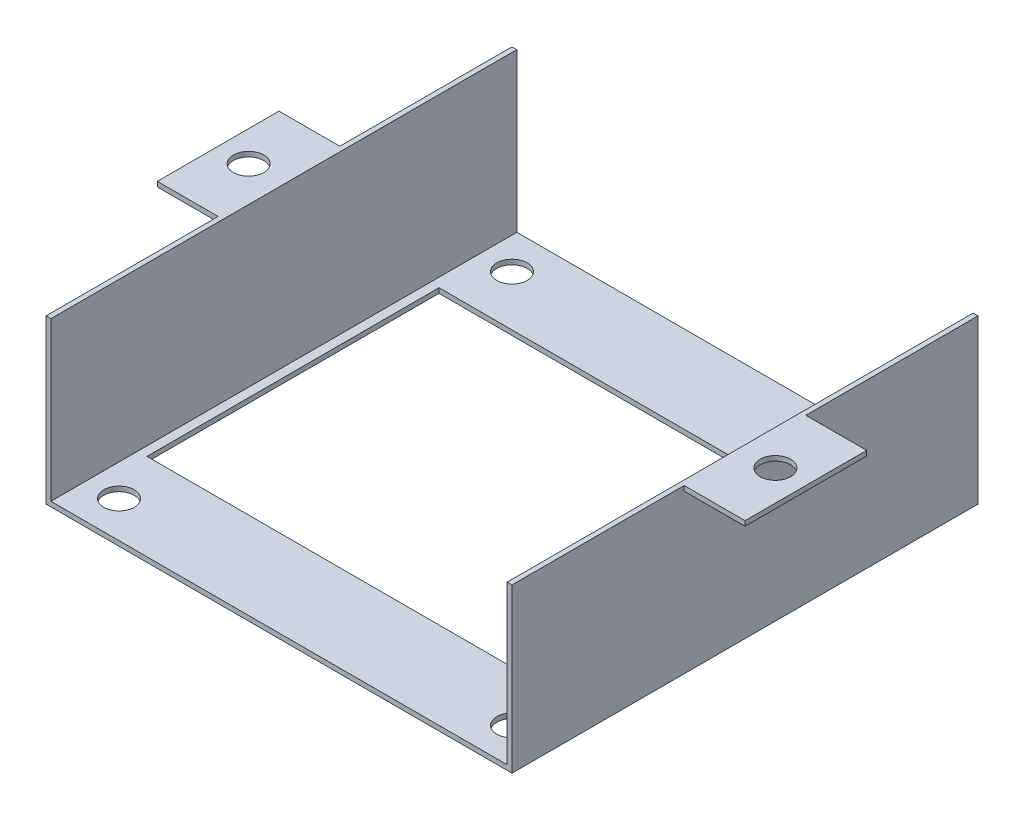
ISO-10303-21;
HEADER;
FILE_DESCRIPTION(('STEP AP214'),'2;1');
FILE_NAME('part.step','',(''),(''),'','','');
FILE_SCHEMA(('AUTOMOTIVE_DESIGN { 1 0 10303 214 1 1 1 1 }'));
ENDSEC;
DATA;
#1=APPLICATION_CONTEXT('core data for automotive mechanical design processes');
#2=APPLICATION_PROTOCOL_DEFINITION('international standard','automotive_design',2000,#1);
#3=PRODUCT_CONTEXT('',#1,'mechanical');
#4=PRODUCT('Part','Part','',(#3));
#5=PRODUCT_RELATED_PRODUCT_CATEGORY('part','',(#4));
#6=PRODUCT_DEFINITION_FORMATION('','',#4);
#7=PRODUCT_DEFINITION_CONTEXT('part definition',#1,'design');
#8=PRODUCT_DEFINITION('design','',#6,#7);
#9=PRODUCT_DEFINITION_SHAPE('','',#8);
#10=(LENGTH_UNIT() NAMED_UNIT(*) SI_UNIT(.MILLI.,.METRE.));
#11=(NAMED_UNIT(*) PLANE_ANGLE_UNIT() SI_UNIT($,.RADIAN.));
#12=(NAMED_UNIT(*) SI_UNIT($,.STERADIAN.) SOLID_ANGLE_UNIT());
#13=UNCERTAINTY_MEASURE_WITH_UNIT(LENGTH_MEASURE(1.E-05),#10,'distance_accuracy_value','');
#14=(GEOMETRIC_REPRESENTATION_CONTEXT(3) GLOBAL_UNCERTAINTY_ASSIGNED_CONTEXT((#13)) GLOBAL_UNIT_ASSIGNED_CONTEXT((#10,
#11,#12)) REPRESENTATION_CONTEXT('',''));
#15=CARTESIAN_POINT('',(0.,0.,0.));
#16=DIRECTION('',(0.,0.,1.));
#17=DIRECTION('',(1.,0.,0.));
#18=AXIS2_PLACEMENT_3D('',#15,#16,#17);
#19=CARTESIAN_POINT('',(0.,26.8,0.));
#20=DIRECTION('',(0.,-1.,0.));
#21=DIRECTION('',(0.,0.,-1.));
#22=AXIS2_PLACEMENT_3D('',#19,#20,#21);
#23=PLANE('',#22);
#24=CARTESIAN_POINT('',(80.8,26.8,37.5));
#25=DIRECTION('',(0.,1.,0.));
#26=DIRECTION('',(0.,0.,1.));
#27=AXIS2_PLACEMENT_3D('',#24,#25,#26);
#28=CIRCLE('',#27,2.49999999999999);
#29=CARTESIAN_POINT('',(80.8,26.8,40.));
#30=VERTEX_POINT('',#29);
#31=EDGE_CURVE('E278',#30,#30,#28,.T.);
#32=ORIENTED_EDGE('',*,*,#31,.F.);
#33=EDGE_LOOP('',(#32));
#34=FACE_BOUND('',#33,.T.);
#35=DIRECTION('',(1.,0.,0.));
#36=VECTOR('',#35,1.);
#37=CARTESIAN_POINT('',(-0.799999999999991,26.8,-0.8));
#38=LINE('',#37,#36);
#39=CARTESIAN_POINT('',(75.,26.8,-0.799999999999995));
#40=VERTEX_POINT('',#39);
#41=CARTESIAN_POINT('',(75.8,26.8,-0.8));
#42=VERTEX_POINT('',#41);
#43=EDGE_CURVE('E197',#40,#42,#38,.T.);
#44=ORIENTED_EDGE('',*,*,#43,.F.);
#45=DIRECTION('',(0.,0.,1.));
#46=VECTOR('',#45,1.);
#47=CARTESIAN_POINT('',(75.,26.8,75.));
#48=LINE('',#47,#46);
#49=CARTESIAN_POINT('',(75.,26.8,75.8));
#50=VERTEX_POINT('',#49);
#51=EDGE_CURVE('E179',#40,#50,#48,.T.);
#52=ORIENTED_EDGE('',*,*,#51,.T.);
#53=DIRECTION('',(-1.,0.,0.));
#54=VECTOR('',#53,1.);
#55=CARTESIAN_POINT('',(-0.800000000000001,26.8,75.8));
#56=LINE('',#55,#54);
#57=CARTESIAN_POINT('',(75.8,26.8,75.8));
#58=VERTEX_POINT('',#57);
#59=EDGE_CURVE('E205',#58,#50,#56,.T.);
#60=ORIENTED_EDGE('',*,*,#59,.F.);
#61=DIRECTION('',(0.,0.,1.));
#62=VECTOR('',#61,1.);
#63=CARTESIAN_POINT('',(75.8,26.8,75.8));
#64=LINE('',#63,#62);
#65=CARTESIAN_POINT('',(75.8,26.8,47.5));
#66=VERTEX_POINT('',#65);
#67=EDGE_CURVE('E196',#66,#58,#64,.T.);
#68=ORIENTED_EDGE('',*,*,#67,.F.);
#69=DIRECTION('',(1.,0.,0.));
#70=VECTOR('',#69,1.);
#71=CARTESIAN_POINT('',(75.,26.8,47.5));
#72=LINE('',#71,#70);
#73=CARTESIAN_POINT('',(85.8,26.8,47.5));
#74=VERTEX_POINT('',#73);
#75=EDGE_CURVE('E309',#66,#74,#72,.T.);
#76=ORIENTED_EDGE('',*,*,#75,.T.);
#77=DIRECTION('',(0.,0.,-1.));
#78=VECTOR('',#77,1.);
#79=CARTESIAN_POINT('',(85.8,26.8,27.5));
#80=LINE('',#79,#78);
#81=CARTESIAN_POINT('',(85.8,26.8,27.5));
#82=VERTEX_POINT('',#81);
#83=EDGE_CURVE('E321',#74,#82,#80,.T.);
#84=ORIENTED_EDGE('',*,*,#83,.T.);
#85=DIRECTION('',(-1.,0.,0.));
#86=VECTOR('',#85,1.);
#87=CARTESIAN_POINT('',(75.,26.8,27.5));
#88=LINE('',#87,#86);
#89=CARTESIAN_POINT('',(75.8,26.8,27.5));
#90=VERTEX_POINT('',#89);
#91=EDGE_CURVE('E313',#82,#90,#88,.T.);
#92=ORIENTED_EDGE('',*,*,#91,.T.);
#93=EDGE_CURVE('E199',#42,#90,#64,.T.);
#94=ORIENTED_EDGE('',*,*,#93,.F.);
#95=EDGE_LOOP('',(#44,#52,#60,#68,#76,#84,#92,#94));
#96=FACE_BOUND('',#95,.T.);
#97=ADVANCED_FACE('F33',(#34,#96),#23,.F.);
#98=CARTESIAN_POINT('',(0.,0.8,0.));
#99=DIRECTION('',(0.,1.,0.));
#100=DIRECTION('',(0.,0.,1.));
#101=AXIS2_PLACEMENT_3D('',#98,#99,#100);
#102=PLANE('',#101);
#103=CARTESIAN_POINT('',(69.8,0.8,5.2));
#104=DIRECTION('',(0.,1.,0.));
#105=DIRECTION('',(0.,0.,1.));
#106=AXIS2_PLACEMENT_3D('',#103,#104,#105);
#107=CIRCLE('',#106,2.5);
#108=CARTESIAN_POINT('',(69.8,0.8,7.69999999999999));
#109=VERTEX_POINT('',#108);
#110=EDGE_CURVE('E492',#109,#109,#107,.T.);
#111=ORIENTED_EDGE('',*,*,#110,.F.);
#112=EDGE_LOOP('',(#111));
#113=FACE_BOUND('',#112,.T.);
#114=CARTESIAN_POINT('',(5.20000000000002,0.8,5.19999999999999));
#115=DIRECTION('',(0.,1.,0.));
#116=DIRECTION('',(0.,0.,1.));
#117=AXIS2_PLACEMENT_3D('',#114,#115,#116);
#118=CIRCLE('',#117,2.49999999999999);
#119=CARTESIAN_POINT('',(5.20000000000002,0.8,7.69999999999998));
#120=VERTEX_POINT('',#119);
#121=EDGE_CURVE('E488',#120,#120,#118,.T.);
#122=ORIENTED_EDGE('',*,*,#121,.F.);
#123=EDGE_LOOP('',(#122));
#124=FACE_BOUND('',#123,.T.);
#125=CARTESIAN_POINT('',(5.20000000000002,0.8,69.8));
#126=DIRECTION('',(0.,1.,0.));
#127=DIRECTION('',(0.,0.,1.));
#128=AXIS2_PLACEMENT_3D('',#125,#126,#127);
#129=CIRCLE('',#128,2.49999999999999);
#130=CARTESIAN_POINT('',(5.20000000000002,0.8,72.3));
#131=VERTEX_POINT('',#130);
#132=EDGE_CURVE('E479',#131,#131,#129,.T.);
#133=ORIENTED_EDGE('',*,*,#132,.F.);
#134=EDGE_LOOP('',(#133));
#135=FACE_BOUND('',#134,.T.);
#136=CARTESIAN_POINT('',(69.8,0.8,69.8));
#137=DIRECTION('',(0.,1.,0.));
#138=DIRECTION('',(0.,0.,1.));
#139=AXIS2_PLACEMENT_3D('',#136,#137,#138);
#140=CIRCLE('',#139,2.5);
#141=CARTESIAN_POINT('',(69.8,0.8,72.3));
#142=VERTEX_POINT('',#141);
#143=EDGE_CURVE('E266',#142,#142,#140,.T.);
#144=ORIENTED_EDGE('',*,*,#143,.F.);
#145=EDGE_LOOP('',(#144));
#146=FACE_BOUND('',#145,.T.);
#147=DIRECTION('',(0.,0.,1.));
#148=VECTOR('',#147,1.);
#149=CARTESIAN_POINT('',(0.,0.8,0.));
#150=LINE('',#149,#148);
#151=CARTESIAN_POINT('',(0.,0.8,-0.799999999999995));
#152=VERTEX_POINT('',#151);
#153=CARTESIAN_POINT('',(0.,0.8,75.8));
#154=VERTEX_POINT('',#153);
#155=EDGE_CURVE('E42',#152,#154,#150,.T.);
#156=ORIENTED_EDGE('',*,*,#155,.T.);
#157=DIRECTION('',(1.,0.,0.));
#158=VECTOR('',#157,1.);
#159=CARTESIAN_POINT('',(0.,0.8,75.8));
#160=LINE('',#159,#158);
#161=CARTESIAN_POINT('',(75.,0.8,75.8));
#162=VERTEX_POINT('',#161);
#163=EDGE_CURVE('E262',#154,#162,#160,.T.);
#164=ORIENTED_EDGE('',*,*,#163,.T.);
#165=DIRECTION('',(0.,0.,-1.));
#166=VECTOR('',#165,1.);
#167=CARTESIAN_POINT('',(75.,0.8,0.));
#168=LINE('',#167,#166);
#169=CARTESIAN_POINT('',(75.,0.8,-0.799999999999995));
#170=VERTEX_POINT('',#169);
#171=EDGE_CURVE('E11',#162,#170,#168,.T.);
#172=ORIENTED_EDGE('',*,*,#171,.T.);
#173=DIRECTION('',(1.,0.,0.));
#174=VECTOR('',#173,1.);
#175=CARTESIAN_POINT('',(0.,0.8,-0.799999999999995));
#176=LINE('',#175,#174);
#177=EDGE_CURVE('E188',#152,#170,#176,.T.);
#178=ORIENTED_EDGE('',*,*,#177,.F.);
#179=EDGE_LOOP('',(#156,#164,#172,#178));
#180=FACE_BOUND('',#179,.T.);
#181=DIRECTION('',(-1.,0.,0.));
#182=VECTOR('',#181,1.);
#183=CARTESIAN_POINT('',(73.5,0.8,13.5));
#184=LINE('',#183,#182);
#185=CARTESIAN_POINT('',(73.5,0.8,13.5));
#186=VERTEX_POINT('',#185);
#187=CARTESIAN_POINT('',(1.50000000000002,0.8,13.5));
#188=VERTEX_POINT('',#187);
#189=EDGE_CURVE('E231',#186,#188,#184,.T.);
#190=ORIENTED_EDGE('',*,*,#189,.F.);
#191=DIRECTION('',(0.,0.,-1.));
#192=VECTOR('',#191,1.);
#193=CARTESIAN_POINT('',(73.5,0.8,61.5));
#194=LINE('',#193,#192);
#195=CARTESIAN_POINT('',(73.5,0.8,61.5));
#196=VERTEX_POINT('',#195);
#197=EDGE_CURVE('E229',#196,#186,#194,.T.);
#198=ORIENTED_EDGE('',*,*,#197,.F.);
#199=DIRECTION('',(1.,0.,0.));
#200=VECTOR('',#199,1.);
#201=CARTESIAN_POINT('',(1.50000000000001,0.8,61.5));
#202=LINE('',#201,#200);
#203=CARTESIAN_POINT('',(1.50000000000001,0.8,61.5));
#204=VERTEX_POINT('',#203);
#205=EDGE_CURVE('E237',#204,#196,#202,.T.);
#206=ORIENTED_EDGE('',*,*,#205,.F.);
#207=DIRECTION('',(0.,0.,1.));
#208=VECTOR('',#207,1.);
#209=CARTESIAN_POINT('',(1.50000000000002,0.8,13.5));
#210=LINE('',#209,#208);
#211=EDGE_CURVE('E234',#188,#204,#210,.T.);
#212=ORIENTED_EDGE('',*,*,#211,.F.);
#213=EDGE_LOOP('',(#190,#198,#206,#212));
#214=FACE_BOUND('',#213,.T.);
#215=ADVANCED_FACE('F259',(#113,#124,#135,#146,#180,#214),#102,.T.);
#216=CARTESIAN_POINT('',(0.,0.,0.));
#217=DIRECTION('',(0.,1.,0.));
#218=DIRECTION('',(0.,0.,1.));
#219=AXIS2_PLACEMENT_3D('',#216,#217,#218);
#220=PLANE('',#219);
#221=CARTESIAN_POINT('',(69.8,0.,5.2));
#222=DIRECTION('',(0.,-1.,0.));
#223=DIRECTION('',(0.,0.,-1.));
#224=AXIS2_PLACEMENT_3D('',#221,#222,#223);
#225=CIRCLE('',#224,2.49999999999999);
#226=CARTESIAN_POINT('',(69.8,0.,2.70000000000001));
#227=VERTEX_POINT('',#226);
#228=EDGE_CURVE('E466',#227,#227,#225,.T.);
#229=ORIENTED_EDGE('',*,*,#228,.F.);
#230=EDGE_LOOP('',(#229));
#231=FACE_BOUND('',#230,.T.);
#232=CARTESIAN_POINT('',(5.20000000000002,0.,5.19999999999999));
#233=DIRECTION('',(0.,-1.,0.));
#234=DIRECTION('',(0.,0.,-1.));
#235=AXIS2_PLACEMENT_3D('',#232,#233,#234);
#236=CIRCLE('',#235,2.49999999999999);
#237=CARTESIAN_POINT('',(5.20000000000002,0.,2.7));
#238=VERTEX_POINT('',#237);
#239=EDGE_CURVE('E470',#238,#238,#236,.T.);
#240=ORIENTED_EDGE('',*,*,#239,.F.);
#241=EDGE_LOOP('',(#240));
#242=FACE_BOUND('',#241,.T.);
#243=CARTESIAN_POINT('',(5.20000000000002,0.,69.8));
#244=DIRECTION('',(0.,-1.,0.));
#245=DIRECTION('',(0.,0.,-1.));
#246=AXIS2_PLACEMENT_3D('',#243,#244,#245);
#247=CIRCLE('',#246,2.49999999999999);
#248=CARTESIAN_POINT('',(5.20000000000002,0.,67.3));
#249=VERTEX_POINT('',#248);
#250=EDGE_CURVE('E474',#249,#249,#247,.T.);
#251=ORIENTED_EDGE('',*,*,#250,.F.);
#252=EDGE_LOOP('',(#251));
#253=FACE_BOUND('',#252,.T.);
#254=CARTESIAN_POINT('',(69.8,0.,69.8));
#255=DIRECTION('',(0.,-1.,0.));
#256=DIRECTION('',(0.,0.,-1.));
#257=AXIS2_PLACEMENT_3D('',#254,#255,#256);
#258=CIRCLE('',#257,2.49999999999999);
#259=CARTESIAN_POINT('',(69.8,0.,67.3));
#260=VERTEX_POINT('',#259);
#261=EDGE_CURVE('E477',#260,#260,#258,.T.);
#262=ORIENTED_EDGE('',*,*,#261,.F.);
#263=EDGE_LOOP('',(#262));
#264=FACE_BOUND('',#263,.T.);
#265=DIRECTION('',(0.,0.,-1.));
#266=VECTOR('',#265,1.);
#267=CARTESIAN_POINT('',(73.5,0.,37.5));
#268=LINE('',#267,#266);
#269=CARTESIAN_POINT('',(73.5,0.,61.5));
#270=VERTEX_POINT('',#269);
#271=CARTESIAN_POINT('',(73.5,0.,13.5));
#272=VERTEX_POINT('',#271);
#273=EDGE_CURVE('E223',#270,#272,#268,.T.);
#274=ORIENTED_EDGE('',*,*,#273,.T.);
#275=DIRECTION('',(-1.,0.,0.));
#276=VECTOR('',#275,1.);
#277=CARTESIAN_POINT('',(73.5,0.,13.5));
#278=LINE('',#277,#276);
#279=CARTESIAN_POINT('',(1.50000000000002,0.,13.5));
#280=VERTEX_POINT('',#279);
#281=EDGE_CURVE('E242',#272,#280,#278,.T.);
#282=ORIENTED_EDGE('',*,*,#281,.T.);
#283=DIRECTION('',(0.,0.,1.));
#284=VECTOR('',#283,1.);
#285=CARTESIAN_POINT('',(1.50000000000002,0.,13.5));
#286=LINE('',#285,#284);
#287=CARTESIAN_POINT('',(1.50000000000001,0.,61.5));
#288=VERTEX_POINT('',#287);
#289=EDGE_CURVE('E245',#280,#288,#286,.T.);
#290=ORIENTED_EDGE('',*,*,#289,.T.);
#291=DIRECTION('',(1.,0.,0.));
#292=VECTOR('',#291,1.);
#293=CARTESIAN_POINT('',(1.50000000000001,0.,61.5));
#294=LINE('',#293,#292);
#295=EDGE_CURVE('E232',#288,#270,#294,.T.);
#296=ORIENTED_EDGE('',*,*,#295,.T.);
#297=EDGE_LOOP('',(#274,#282,#290,#296));
#298=FACE_BOUND('',#297,.T.);
#299=DIRECTION('',(0.,0.,-1.));
#300=VECTOR('',#299,1.);
#301=CARTESIAN_POINT('',(-0.800000000000001,0.,75.8));
#302=LINE('',#301,#300);
#303=CARTESIAN_POINT('',(-0.800000000000001,0.,75.8));
#304=VERTEX_POINT('',#303);
#305=CARTESIAN_POINT('',(-0.799999999999991,0.,-0.8));
#306=VERTEX_POINT('',#305);
#307=EDGE_CURVE('E208',#304,#306,#302,.T.);
#308=ORIENTED_EDGE('',*,*,#307,.T.);
#309=DIRECTION('',(1.,0.,0.));
#310=VECTOR('',#309,1.);
#311=CARTESIAN_POINT('',(-0.799999999999991,0.,-0.8));
#312=LINE('',#311,#310);
#313=CARTESIAN_POINT('',(75.8,0.,-0.8));
#314=VERTEX_POINT('',#313);
#315=EDGE_CURVE('E211',#306,#314,#312,.T.);
#316=ORIENTED_EDGE('',*,*,#315,.T.);
#317=DIRECTION('',(0.,0.,1.));
#318=VECTOR('',#317,1.);
#319=CARTESIAN_POINT('',(75.8,0.,75.8));
#320=LINE('',#319,#318);
#321=CARTESIAN_POINT('',(75.8,0.,75.8));
#322=VERTEX_POINT('',#321);
#323=EDGE_CURVE('E214',#314,#322,#320,.T.);
#324=ORIENTED_EDGE('',*,*,#323,.T.);
#325=DIRECTION('',(-1.,0.,0.));
#326=VECTOR('',#325,1.);
#327=CARTESIAN_POINT('',(-0.800000000000001,0.,75.8));
#328=LINE('',#327,#326);
#329=EDGE_CURVE('E217',#322,#304,#328,.T.);
#330=ORIENTED_EDGE('',*,*,#329,.T.);
#331=EDGE_LOOP('',(#308,#316,#324,#330));
#332=FACE_BOUND('',#331,.T.);
#333=ADVANCED_FACE('F35',(#231,#242,#253,#264,#298,#332),#220,.F.);
#334=CARTESIAN_POINT('',(73.5,0.8,37.5));
#335=DIRECTION('',(-1.,0.,0.));
#336=DIRECTION('',(0.,0.,1.));
#337=AXIS2_PLACEMENT_3D('',#334,#335,#336);
#338=PLANE('',#337);
#339=ORIENTED_EDGE('',*,*,#273,.F.);
#340=DIRECTION('',(0.,-1.,0.));
#341=VECTOR('',#340,1.);
#342=CARTESIAN_POINT('',(73.5,0.8,61.5));
#343=LINE('',#342,#341);
#344=EDGE_CURVE('E239',#196,#270,#343,.T.);
#345=ORIENTED_EDGE('',*,*,#344,.F.);
#346=ORIENTED_EDGE('',*,*,#197,.T.);
#347=DIRECTION('',(0.,-1.,0.));
#348=VECTOR('',#347,1.);
#349=CARTESIAN_POINT('',(73.5,0.8,13.5));
#350=LINE('',#349,#348);
#351=EDGE_CURVE('E255',#186,#272,#350,.T.);
#352=ORIENTED_EDGE('',*,*,#351,.T.);
#353=EDGE_LOOP('',(#339,#345,#346,#352));
#354=FACE_BOUND('',#353,.T.);
#355=ADVANCED_FACE('F441',(#354),#338,.T.);
#356=CARTESIAN_POINT('',(73.5,0.8,13.5));
#357=DIRECTION('',(0.,0.,1.));
#358=DIRECTION('',(1.,0.,0.));
#359=AXIS2_PLACEMENT_3D('',#356,#357,#358);
#360=PLANE('',#359);
#361=ORIENTED_EDGE('',*,*,#281,.F.);
#362=ORIENTED_EDGE('',*,*,#351,.F.);
#363=ORIENTED_EDGE('',*,*,#189,.T.);
#364=DIRECTION('',(0.,-1.,0.));
#365=VECTOR('',#364,1.);
#366=CARTESIAN_POINT('',(1.50000000000002,0.8,13.5));
#367=LINE('',#366,#365);
#368=EDGE_CURVE('E253',#188,#280,#367,.T.);
#369=ORIENTED_EDGE('',*,*,#368,.T.);
#370=EDGE_LOOP('',(#361,#362,#363,#369));
#371=FACE_BOUND('',#370,.T.);
#372=ADVANCED_FACE('F437',(#371),#360,.T.);
#373=CARTESIAN_POINT('',(1.50000000000002,0.8,13.5));
#374=DIRECTION('',(1.,0.,0.));
#375=DIRECTION('',(0.,0.,-1.));
#376=AXIS2_PLACEMENT_3D('',#373,#374,#375);
#377=PLANE('',#376);
#378=ORIENTED_EDGE('',*,*,#289,.F.);
#379=ORIENTED_EDGE('',*,*,#368,.F.);
#380=ORIENTED_EDGE('',*,*,#211,.T.);
#381=DIRECTION('',(0.,-1.,0.));
#382=VECTOR('',#381,1.);
#383=CARTESIAN_POINT('',(1.50000000000001,0.8,61.5));
#384=LINE('',#383,#382);
#385=EDGE_CURVE('E251',#204,#288,#384,.T.);
#386=ORIENTED_EDGE('',*,*,#385,.T.);
#387=EDGE_LOOP('',(#378,#379,#380,#386));
#388=FACE_BOUND('',#387,.T.);
#389=ADVANCED_FACE('F430',(#388),#377,.T.);
#390=CARTESIAN_POINT('',(1.50000000000001,0.8,61.5));
#391=DIRECTION('',(0.,0.,-1.));
#392=DIRECTION('',(-1.,0.,0.));
#393=AXIS2_PLACEMENT_3D('',#390,#391,#392);
#394=PLANE('',#393);
#395=ORIENTED_EDGE('',*,*,#295,.F.);
#396=ORIENTED_EDGE('',*,*,#385,.F.);
#397=ORIENTED_EDGE('',*,*,#205,.T.);
#398=ORIENTED_EDGE('',*,*,#344,.T.);
#399=EDGE_LOOP('',(#395,#396,#397,#398));
#400=FACE_BOUND('',#399,.T.);
#401=ADVANCED_FACE('F424',(#400),#394,.T.);
#402=CARTESIAN_POINT('',(-0.800000000000001,26.8,75.8));
#403=DIRECTION('',(-1.,0.,0.));
#404=DIRECTION('',(0.,0.,1.));
#405=AXIS2_PLACEMENT_3D('',#402,#403,#404);
#406=PLANE('',#405);
#407=DIRECTION('',(0.,-1.,0.));
#408=VECTOR('',#407,1.);
#409=CARTESIAN_POINT('',(-0.799999999999995,26.8,27.5));
#410=LINE('',#409,#408);
#411=CARTESIAN_POINT('',(-0.800000000000001,26.8,27.5));
#412=VERTEX_POINT('',#411);
#413=CARTESIAN_POINT('',(-0.799999999999995,26.,27.5));
#414=VERTEX_POINT('',#413);
#415=EDGE_CURVE('E307',#412,#414,#410,.T.);
#416=ORIENTED_EDGE('',*,*,#415,.F.);
#417=DIRECTION('',(0.,0.,-1.));
#418=VECTOR('',#417,1.);
#419=CARTESIAN_POINT('',(-0.800000000000001,26.8,75.8));
#420=LINE('',#419,#418);
#421=CARTESIAN_POINT('',(-0.799999999999991,26.8,-0.8));
#422=VERTEX_POINT('',#421);
#423=EDGE_CURVE('E220',#412,#422,#420,.T.);
#424=ORIENTED_EDGE('',*,*,#423,.T.);
#425=DIRECTION('',(0.,-1.,0.));
#426=VECTOR('',#425,1.);
#427=CARTESIAN_POINT('',(-0.799999999999991,26.8,-0.8));
#428=LINE('',#427,#426);
#429=EDGE_CURVE('E195',#422,#306,#428,.T.);
#430=ORIENTED_EDGE('',*,*,#429,.T.);
#431=ORIENTED_EDGE('',*,*,#307,.F.);
#432=DIRECTION('',(0.,-1.,0.));
#433=VECTOR('',#432,1.);
#434=CARTESIAN_POINT('',(-0.800000000000001,26.8,75.8));
#435=LINE('',#434,#433);
#436=CARTESIAN_POINT('',(-0.800000000000001,26.8,75.8));
#437=VERTEX_POINT('',#436);
#438=EDGE_CURVE('E221',#437,#304,#435,.T.);
#439=ORIENTED_EDGE('',*,*,#438,.F.);
#440=CARTESIAN_POINT('',(-0.799999999999997,26.8,47.5));
#441=VERTEX_POINT('',#440);
#442=EDGE_CURVE('E201',#437,#441,#420,.T.);
#443=ORIENTED_EDGE('',*,*,#442,.T.);
#444=DIRECTION('',(0.,1.,0.));
#445=VECTOR('',#444,1.);
#446=CARTESIAN_POINT('',(-0.799999999999997,26.8,47.5));
#447=LINE('',#446,#445);
#448=CARTESIAN_POINT('',(-0.799999999999997,26.,47.5));
#449=VERTEX_POINT('',#448);
#450=EDGE_CURVE('E54',#449,#441,#447,.T.);
#451=ORIENTED_EDGE('',*,*,#450,.F.);
#452=DIRECTION('',(0.,0.,-1.));
#453=VECTOR('',#452,1.);
#454=CARTESIAN_POINT('',(-0.800000000000001,26.,75.8));
#455=LINE('',#454,#453);
#456=EDGE_CURVE('E49',#449,#414,#455,.T.);
#457=ORIENTED_EDGE('',*,*,#456,.T.);
#458=EDGE_LOOP('',(#416,#424,#430,#431,#439,#443,#451,#457));
#459=FACE_BOUND('',#458,.T.);
#460=ADVANCED_FACE('F421',(#459),#406,.T.);
#461=CARTESIAN_POINT('',(-0.800000000000001,26.8,75.8));
#462=DIRECTION('',(0.,0.,1.));
#463=DIRECTION('',(1.,0.,0.));
#464=AXIS2_PLACEMENT_3D('',#461,#462,#463);
#465=PLANE('',#464);
#466=DIRECTION('',(0.,1.,0.));
#467=VECTOR('',#466,1.);
#468=CARTESIAN_POINT('',(75.,0.8,75.8));
#469=LINE('',#468,#467);
#470=EDGE_CURVE('E189',#162,#50,#469,.T.);
#471=ORIENTED_EDGE('',*,*,#470,.F.);
#472=ORIENTED_EDGE('',*,*,#163,.F.);
#473=DIRECTION('',(0.,-1.,0.));
#474=VECTOR('',#473,1.);
#475=CARTESIAN_POINT('',(0.,26.8,75.8));
#476=LINE('',#475,#474);
#477=CARTESIAN_POINT('',(0.,26.8,75.8));
#478=VERTEX_POINT('',#477);
#479=EDGE_CURVE('E264',#478,#154,#476,.T.);
#480=ORIENTED_EDGE('',*,*,#479,.F.);
#481=EDGE_CURVE('E175',#478,#437,#56,.T.);
#482=ORIENTED_EDGE('',*,*,#481,.T.);
#483=ORIENTED_EDGE('',*,*,#438,.T.);
#484=ORIENTED_EDGE('',*,*,#329,.F.);
#485=DIRECTION('',(0.,-1.,0.));
#486=VECTOR('',#485,1.);
#487=CARTESIAN_POINT('',(75.8,26.8,75.8));
#488=LINE('',#487,#486);
#489=EDGE_CURVE('E224',#58,#322,#488,.T.);
#490=ORIENTED_EDGE('',*,*,#489,.F.);
#491=ORIENTED_EDGE('',*,*,#59,.T.);
#492=EDGE_LOOP('',(#471,#472,#480,#482,#483,#484,#490,#491));
#493=FACE_BOUND('',#492,.T.);
#494=ADVANCED_FACE('F268',(#493),#465,.T.);
#495=CARTESIAN_POINT('',(75.8,26.8,75.8));
#496=DIRECTION('',(1.,0.,0.));
#497=DIRECTION('',(0.,0.,-1.));
#498=AXIS2_PLACEMENT_3D('',#495,#496,#497);
#499=PLANE('',#498);
#500=DIRECTION('',(0.,1.,0.));
#501=VECTOR('',#500,1.);
#502=CARTESIAN_POINT('',(75.8,26.8,27.5));
#503=LINE('',#502,#501);
#504=CARTESIAN_POINT('',(75.8,26.,27.5));
#505=VERTEX_POINT('',#504);
#506=EDGE_CURVE('E180',#505,#90,#503,.T.);
#507=ORIENTED_EDGE('',*,*,#506,.F.);
#508=DIRECTION('',(0.,0.,1.));
#509=VECTOR('',#508,1.);
#510=CARTESIAN_POINT('',(75.8,26.,75.8));
#511=LINE('',#510,#509);
#512=CARTESIAN_POINT('',(75.8,26.,47.5));
#513=VERTEX_POINT('',#512);
#514=EDGE_CURVE('E328',#505,#513,#511,.T.);
#515=ORIENTED_EDGE('',*,*,#514,.T.);
#516=DIRECTION('',(0.,-1.,0.));
#517=VECTOR('',#516,1.);
#518=CARTESIAN_POINT('',(75.8,26.8,47.5));
#519=LINE('',#518,#517);
#520=EDGE_CURVE('E332',#66,#513,#519,.T.);
#521=ORIENTED_EDGE('',*,*,#520,.F.);
#522=ORIENTED_EDGE('',*,*,#67,.T.);
#523=ORIENTED_EDGE('',*,*,#489,.T.);
#524=ORIENTED_EDGE('',*,*,#323,.F.);
#525=DIRECTION('',(0.,-1.,0.));
#526=VECTOR('',#525,1.);
#527=CARTESIAN_POINT('',(75.8,26.8,-0.8));
#528=LINE('',#527,#526);
#529=EDGE_CURVE('E226',#42,#314,#528,.T.);
#530=ORIENTED_EDGE('',*,*,#529,.F.);
#531=ORIENTED_EDGE('',*,*,#93,.T.);
#532=EDGE_LOOP('',(#507,#515,#521,#522,#523,#524,#530,#531));
#533=FACE_BOUND('',#532,.T.);
#534=ADVANCED_FACE('F347',(#533),#499,.T.);
#535=CARTESIAN_POINT('',(-0.799999999999991,26.8,-0.8));
#536=DIRECTION('',(0.,0.,-1.));
#537=DIRECTION('',(-1.,0.,0.));
#538=AXIS2_PLACEMENT_3D('',#535,#536,#537);
#539=PLANE('',#538);
#540=DIRECTION('',(0.,1.,0.));
#541=VECTOR('',#540,1.);
#542=CARTESIAN_POINT('',(75.,0.8,-0.799999999999995));
#543=LINE('',#542,#541);
#544=EDGE_CURVE('E277',#170,#40,#543,.T.);
#545=ORIENTED_EDGE('',*,*,#544,.T.);
#546=ORIENTED_EDGE('',*,*,#43,.T.);
#547=ORIENTED_EDGE('',*,*,#529,.T.);
#548=ORIENTED_EDGE('',*,*,#315,.F.);
#549=ORIENTED_EDGE('',*,*,#429,.F.);
#550=CARTESIAN_POINT('',(0.,26.8,-0.799999999999995));
#551=VERTEX_POINT('',#550);
#552=EDGE_CURVE('E173',#422,#551,#38,.T.);
#553=ORIENTED_EDGE('',*,*,#552,.T.);
#554=DIRECTION('',(0.,-1.,0.));
#555=VECTOR('',#554,1.);
#556=CARTESIAN_POINT('',(0.,26.8,-0.799999999999995));
#557=LINE('',#556,#555);
#558=EDGE_CURVE('E183',#551,#152,#557,.T.);
#559=ORIENTED_EDGE('',*,*,#558,.T.);
#560=ORIENTED_EDGE('',*,*,#177,.T.);
#561=EDGE_LOOP('',(#545,#546,#547,#548,#549,#553,#559,#560));
#562=FACE_BOUND('',#561,.T.);
#563=ADVANCED_FACE('F193',(#562),#539,.T.);
#564=CARTESIAN_POINT('',(-5.8,26.8,37.5));
#565=DIRECTION('',(0.,1.,0.));
#566=DIRECTION('',(0.,0.,1.));
#567=AXIS2_PLACEMENT_3D('',#564,#565,#566);
#568=CIRCLE('',#567,2.49999999999999);
#569=CARTESIAN_POINT('',(-5.8,26.8,40.));
#570=VERTEX_POINT('',#569);
#571=EDGE_CURVE('E274',#570,#570,#568,.T.);
#572=ORIENTED_EDGE('',*,*,#571,.F.);
#573=EDGE_LOOP('',(#572));
#574=FACE_BOUND('',#573,.T.);
#575=ORIENTED_EDGE('',*,*,#481,.F.);
#576=DIRECTION('',(0.,0.,-1.));
#577=VECTOR('',#576,1.);
#578=CARTESIAN_POINT('',(0.,26.8,75.));
#579=LINE('',#578,#577);
#580=EDGE_CURVE('E169',#478,#551,#579,.T.);
#581=ORIENTED_EDGE('',*,*,#580,.T.);
#582=ORIENTED_EDGE('',*,*,#552,.F.);
#583=ORIENTED_EDGE('',*,*,#423,.F.);
#584=DIRECTION('',(-1.,0.,0.));
#585=VECTOR('',#584,1.);
#586=CARTESIAN_POINT('',(0.,26.8,27.5));
#587=LINE('',#586,#585);
#588=CARTESIAN_POINT('',(-10.8,26.8,27.5));
#589=VERTEX_POINT('',#588);
#590=EDGE_CURVE('E284',#412,#589,#587,.T.);
#591=ORIENTED_EDGE('',*,*,#590,.T.);
#592=DIRECTION('',(0.,0.,1.));
#593=VECTOR('',#592,1.);
#594=CARTESIAN_POINT('',(-10.8,26.8,27.5));
#595=LINE('',#594,#593);
#596=CARTESIAN_POINT('',(-10.8,26.8,47.5));
#597=VERTEX_POINT('',#596);
#598=EDGE_CURVE('E296',#589,#597,#595,.T.);
#599=ORIENTED_EDGE('',*,*,#598,.T.);
#600=DIRECTION('',(1.,0.,0.));
#601=VECTOR('',#600,1.);
#602=CARTESIAN_POINT('',(0.,26.8,47.5));
#603=LINE('',#602,#601);
#604=EDGE_CURVE('E288',#597,#441,#603,.T.);
#605=ORIENTED_EDGE('',*,*,#604,.T.);
#606=ORIENTED_EDGE('',*,*,#442,.F.);
#607=EDGE_LOOP('',(#575,#581,#582,#583,#591,#599,#605,#606));
#608=FACE_BOUND('',#607,.T.);
#609=ADVANCED_FACE('F171',(#574,#608),#23,.F.);
#610=CARTESIAN_POINT('',(0.,26.8,75.));
#611=DIRECTION('',(-1.,0.,0.));
#612=DIRECTION('',(0.,0.,1.));
#613=AXIS2_PLACEMENT_3D('',#610,#611,#612);
#614=PLANE('',#613);
#615=ORIENTED_EDGE('',*,*,#155,.F.);
#616=ORIENTED_EDGE('',*,*,#558,.F.);
#617=ORIENTED_EDGE('',*,*,#580,.F.);
#618=ORIENTED_EDGE('',*,*,#479,.T.);
#619=EDGE_LOOP('',(#615,#616,#617,#618));
#620=FACE_BOUND('',#619,.T.);
#621=ADVANCED_FACE('F184',(#620),#614,.F.);
#622=CARTESIAN_POINT('',(75.,26.8,75.));
#623=DIRECTION('',(1.,0.,0.));
#624=DIRECTION('',(0.,0.,-1.));
#625=AXIS2_PLACEMENT_3D('',#622,#623,#624);
#626=PLANE('',#625);
#627=ORIENTED_EDGE('',*,*,#171,.F.);
#628=ORIENTED_EDGE('',*,*,#470,.T.);
#629=ORIENTED_EDGE('',*,*,#51,.F.);
#630=ORIENTED_EDGE('',*,*,#544,.F.);
#631=EDGE_LOOP('',(#627,#628,#629,#630));
#632=FACE_BOUND('',#631,.T.);
#633=ADVANCED_FACE('F342',(#632),#626,.F.);
#634=CARTESIAN_POINT('',(75.,26.,27.5));
#635=DIRECTION('',(0.,0.,-1.));
#636=DIRECTION('',(-1.,0.,0.));
#637=AXIS2_PLACEMENT_3D('',#634,#635,#636);
#638=PLANE('',#637);
#639=DIRECTION('',(-1.,0.,0.));
#640=VECTOR('',#639,1.);
#641=CARTESIAN_POINT('',(75.,26.,27.5));
#642=LINE('',#641,#640);
#643=CARTESIAN_POINT('',(85.8,26.,27.5));
#644=VERTEX_POINT('',#643);
#645=EDGE_CURVE('E316',#644,#505,#642,.T.);
#646=ORIENTED_EDGE('',*,*,#645,.T.);
#647=ORIENTED_EDGE('',*,*,#506,.T.);
#648=ORIENTED_EDGE('',*,*,#91,.F.);
#649=DIRECTION('',(0.,1.,0.));
#650=VECTOR('',#649,1.);
#651=CARTESIAN_POINT('',(85.8,26.,27.5));
#652=LINE('',#651,#650);
#653=EDGE_CURVE('E326',#644,#82,#652,.T.);
#654=ORIENTED_EDGE('',*,*,#653,.F.);
#655=EDGE_LOOP('',(#646,#647,#648,#654));
#656=FACE_BOUND('',#655,.T.);
#657=ADVANCED_FACE('F355',(#656),#638,.T.);
#658=CARTESIAN_POINT('',(85.8,26.,27.5));
#659=DIRECTION('',(1.,0.,0.));
#660=DIRECTION('',(0.,0.,-1.));
#661=AXIS2_PLACEMENT_3D('',#658,#659,#660);
#662=PLANE('',#661);
#663=ORIENTED_EDGE('',*,*,#83,.F.);
#664=DIRECTION('',(0.,1.,0.));
#665=VECTOR('',#664,1.);
#666=CARTESIAN_POINT('',(85.8,26.,47.5));
#667=LINE('',#666,#665);
#668=CARTESIAN_POINT('',(85.8,26.,47.5));
#669=VERTEX_POINT('',#668);
#670=EDGE_CURVE('E319',#669,#74,#667,.T.);
#671=ORIENTED_EDGE('',*,*,#670,.F.);
#672=DIRECTION('',(0.,0.,-1.));
#673=VECTOR('',#672,1.);
#674=CARTESIAN_POINT('',(85.8,26.,27.5));
#675=LINE('',#674,#673);
#676=EDGE_CURVE('E312',#669,#644,#675,.T.);
#677=ORIENTED_EDGE('',*,*,#676,.T.);
#678=ORIENTED_EDGE('',*,*,#653,.T.);
#679=EDGE_LOOP('',(#663,#671,#677,#678));
#680=FACE_BOUND('',#679,.T.);
#681=ADVANCED_FACE('F367',(#680),#662,.T.);
#682=CARTESIAN_POINT('',(75.,26.,47.5));
#683=DIRECTION('',(0.,0.,1.));
#684=DIRECTION('',(1.,0.,0.));
#685=AXIS2_PLACEMENT_3D('',#682,#683,#684);
#686=PLANE('',#685);
#687=ORIENTED_EDGE('',*,*,#75,.F.);
#688=ORIENTED_EDGE('',*,*,#520,.T.);
#689=DIRECTION('',(1.,0.,0.));
#690=VECTOR('',#689,1.);
#691=CARTESIAN_POINT('',(75.,26.,47.5));
#692=LINE('',#691,#690);
#693=EDGE_CURVE('E310',#513,#669,#692,.T.);
#694=ORIENTED_EDGE('',*,*,#693,.T.);
#695=ORIENTED_EDGE('',*,*,#670,.T.);
#696=EDGE_LOOP('',(#687,#688,#694,#695));
#697=FACE_BOUND('',#696,.T.);
#698=ADVANCED_FACE('F365',(#697),#686,.T.);
#699=CARTESIAN_POINT('',(0.,26.,0.));
#700=DIRECTION('',(0.,1.,0.));
#701=DIRECTION('',(0.,0.,1.));
#702=AXIS2_PLACEMENT_3D('',#699,#700,#701);
#703=PLANE('',#702);
#704=CARTESIAN_POINT('',(80.8,26.,37.5));
#705=DIRECTION('',(0.,1.,0.));
#706=DIRECTION('',(0.,0.,1.));
#707=AXIS2_PLACEMENT_3D('',#704,#705,#706);
#708=CIRCLE('',#707,2.5);
#709=CARTESIAN_POINT('',(80.8,26.,40.));
#710=VERTEX_POINT('',#709);
#711=EDGE_CURVE('E281',#710,#710,#708,.T.);
#712=ORIENTED_EDGE('',*,*,#711,.T.);
#713=EDGE_LOOP('',(#712));
#714=FACE_BOUND('',#713,.T.);
#715=ORIENTED_EDGE('',*,*,#514,.F.);
#716=ORIENTED_EDGE('',*,*,#645,.F.);
#717=ORIENTED_EDGE('',*,*,#676,.F.);
#718=ORIENTED_EDGE('',*,*,#693,.F.);
#719=EDGE_LOOP('',(#715,#716,#717,#718));
#720=FACE_BOUND('',#719,.T.);
#721=ADVANCED_FACE('F360',(#714,#720),#703,.F.);
#722=CARTESIAN_POINT('',(0.,26.,27.5));
#723=DIRECTION('',(0.,0.,-1.));
#724=DIRECTION('',(-1.,0.,0.));
#725=AXIS2_PLACEMENT_3D('',#722,#723,#724);
#726=PLANE('',#725);
#727=ORIENTED_EDGE('',*,*,#590,.F.);
#728=ORIENTED_EDGE('',*,*,#415,.T.);
#729=DIRECTION('',(-1.,0.,0.));
#730=VECTOR('',#729,1.);
#731=CARTESIAN_POINT('',(0.,26.,27.5));
#732=LINE('',#731,#730);
#733=CARTESIAN_POINT('',(-10.8,26.,27.5));
#734=VERTEX_POINT('',#733);
#735=EDGE_CURVE('E285',#414,#734,#732,.T.);
#736=ORIENTED_EDGE('',*,*,#735,.T.);
#737=DIRECTION('',(0.,1.,0.));
#738=VECTOR('',#737,1.);
#739=CARTESIAN_POINT('',(-10.8,26.,27.5));
#740=LINE('',#739,#738);
#741=EDGE_CURVE('E294',#734,#589,#740,.T.);
#742=ORIENTED_EDGE('',*,*,#741,.T.);
#743=EDGE_LOOP('',(#727,#728,#736,#742));
#744=FACE_BOUND('',#743,.T.);
#745=ADVANCED_FACE('F420',(#744),#726,.T.);
#746=CARTESIAN_POINT('',(0.,26.,47.5));
#747=DIRECTION('',(0.,0.,1.));
#748=DIRECTION('',(1.,0.,0.));
#749=AXIS2_PLACEMENT_3D('',#746,#747,#748);
#750=PLANE('',#749);
#751=DIRECTION('',(1.,0.,0.));
#752=VECTOR('',#751,1.);
#753=CARTESIAN_POINT('',(0.,26.,47.5));
#754=LINE('',#753,#752);
#755=CARTESIAN_POINT('',(-10.8,26.,47.5));
#756=VERTEX_POINT('',#755);
#757=EDGE_CURVE('E291',#756,#449,#754,.T.);
#758=ORIENTED_EDGE('',*,*,#757,.T.);
#759=ORIENTED_EDGE('',*,*,#450,.T.);
#760=ORIENTED_EDGE('',*,*,#604,.F.);
#761=DIRECTION('',(0.,1.,0.));
#762=VECTOR('',#761,1.);
#763=CARTESIAN_POINT('',(-10.8,26.,47.5));
#764=LINE('',#763,#762);
#765=EDGE_CURVE('E301',#756,#597,#764,.T.);
#766=ORIENTED_EDGE('',*,*,#765,.F.);
#767=EDGE_LOOP('',(#758,#759,#760,#766));
#768=FACE_BOUND('',#767,.T.);
#769=ADVANCED_FACE('F413',(#768),#750,.T.);
#770=CARTESIAN_POINT('',(-10.8,26.,27.5));
#771=DIRECTION('',(-1.,0.,0.));
#772=DIRECTION('',(0.,0.,1.));
#773=AXIS2_PLACEMENT_3D('',#770,#771,#772);
#774=PLANE('',#773);
#775=ORIENTED_EDGE('',*,*,#598,.F.);
#776=ORIENTED_EDGE('',*,*,#741,.F.);
#777=DIRECTION('',(0.,0.,1.));
#778=VECTOR('',#777,1.);
#779=CARTESIAN_POINT('',(-10.8,26.,27.5));
#780=LINE('',#779,#778);
#781=EDGE_CURVE('E287',#734,#756,#780,.T.);
#782=ORIENTED_EDGE('',*,*,#781,.T.);
#783=ORIENTED_EDGE('',*,*,#765,.T.);
#784=EDGE_LOOP('',(#775,#776,#782,#783));
#785=FACE_BOUND('',#784,.T.);
#786=ADVANCED_FACE('F407',(#785),#774,.T.);
#787=CARTESIAN_POINT('',(0.,26.,0.));
#788=DIRECTION('',(0.,1.,0.));
#789=DIRECTION('',(0.,0.,1.));
#790=AXIS2_PLACEMENT_3D('',#787,#788,#789);
#791=PLANE('',#790);
#792=CARTESIAN_POINT('',(-5.8,26.,37.5));
#793=DIRECTION('',(0.,1.,0.));
#794=DIRECTION('',(0.,0.,1.));
#795=AXIS2_PLACEMENT_3D('',#792,#793,#794);
#796=CIRCLE('',#795,2.49999999999999);
#797=CARTESIAN_POINT('',(-5.8,26.,40.));
#798=VERTEX_POINT('',#797);
#799=EDGE_CURVE('E37',#798,#798,#796,.T.);
#800=ORIENTED_EDGE('',*,*,#799,.T.);
#801=EDGE_LOOP('',(#800));
#802=FACE_BOUND('',#801,.T.);
#803=ORIENTED_EDGE('',*,*,#456,.F.);
#804=ORIENTED_EDGE('',*,*,#757,.F.);
#805=ORIENTED_EDGE('',*,*,#781,.F.);
#806=ORIENTED_EDGE('',*,*,#735,.F.);
#807=EDGE_LOOP('',(#803,#804,#805,#806));
#808=FACE_BOUND('',#807,.T.);
#809=ADVANCED_FACE('F404',(#802,#808),#791,.F.);
#810=CARTESIAN_POINT('',(80.8,26.8,37.5));
#811=DIRECTION('',(0.,1.,0.));
#812=DIRECTION('',(0.,0.,1.));
#813=AXIS2_PLACEMENT_3D('',#810,#811,#812);
#814=CYLINDRICAL_SURFACE('',#813,2.5);
#815=ORIENTED_EDGE('',*,*,#31,.T.);
#816=EDGE_LOOP('',(#815));
#817=FACE_BOUND('',#816,.T.);
#818=ORIENTED_EDGE('',*,*,#711,.F.);
#819=EDGE_LOOP('',(#818));
#820=FACE_BOUND('',#819,.T.);
#821=ADVANCED_FACE('F399',(#817,#820),#814,.F.);
#822=CARTESIAN_POINT('',(-5.8,26.8,37.5));
#823=DIRECTION('',(0.,1.,0.));
#824=DIRECTION('',(0.,0.,1.));
#825=AXIS2_PLACEMENT_3D('',#822,#823,#824);
#826=CYLINDRICAL_SURFACE('',#825,2.49999999999999);
#827=ORIENTED_EDGE('',*,*,#571,.T.);
#828=EDGE_LOOP('',(#827));
#829=FACE_BOUND('',#828,.T.);
#830=ORIENTED_EDGE('',*,*,#799,.F.);
#831=EDGE_LOOP('',(#830));
#832=FACE_BOUND('',#831,.T.);
#833=ADVANCED_FACE('F395',(#829,#832),#826,.F.);
#834=CARTESIAN_POINT('',(69.8,0.,69.8));
#835=DIRECTION('',(0.,-1.,0.));
#836=DIRECTION('',(0.,0.,-1.));
#837=AXIS2_PLACEMENT_3D('',#834,#835,#836);
#838=CYLINDRICAL_SURFACE('',#837,2.5);
#839=ORIENTED_EDGE('',*,*,#143,.T.);
#840=EDGE_LOOP('',(#839));
#841=FACE_BOUND('',#840,.T.);
#842=ORIENTED_EDGE('',*,*,#261,.T.);
#843=EDGE_LOOP('',(#842));
#844=FACE_BOUND('',#843,.T.);
#845=ADVANCED_FACE('F398',(#841,#844),#838,.F.);
#846=CARTESIAN_POINT('',(5.20000000000002,0.,69.8));
#847=DIRECTION('',(0.,-1.,0.));
#848=DIRECTION('',(0.,0.,-1.));
#849=AXIS2_PLACEMENT_3D('',#846,#847,#848);
#850=CYLINDRICAL_SURFACE('',#849,2.49999999999999);
#851=ORIENTED_EDGE('',*,*,#132,.T.);
#852=EDGE_LOOP('',(#851));
#853=FACE_BOUND('',#852,.T.);
#854=ORIENTED_EDGE('',*,*,#250,.T.);
#855=EDGE_LOOP('',(#854));
#856=FACE_BOUND('',#855,.T.);
#857=ADVANCED_FACE('F504',(#853,#856),#850,.F.);
#858=CARTESIAN_POINT('',(5.20000000000002,0.,5.19999999999999));
#859=DIRECTION('',(0.,-1.,0.));
#860=DIRECTION('',(0.,0.,-1.));
#861=AXIS2_PLACEMENT_3D('',#858,#859,#860);
#862=CYLINDRICAL_SURFACE('',#861,2.49999999999999);
#863=ORIENTED_EDGE('',*,*,#121,.T.);
#864=EDGE_LOOP('',(#863));
#865=FACE_BOUND('',#864,.T.);
#866=ORIENTED_EDGE('',*,*,#239,.T.);
#867=EDGE_LOOP('',(#866));
#868=FACE_BOUND('',#867,.T.);
#869=ADVANCED_FACE('F498',(#865,#868),#862,.F.);
#870=CARTESIAN_POINT('',(69.8,0.,5.2));
#871=DIRECTION('',(0.,-1.,0.));
#872=DIRECTION('',(0.,0.,-1.));
#873=AXIS2_PLACEMENT_3D('',#870,#871,#872);
#874=CYLINDRICAL_SURFACE('',#873,2.5);
#875=ORIENTED_EDGE('',*,*,#110,.T.);
#876=EDGE_LOOP('',(#875));
#877=FACE_BOUND('',#876,.T.);
#878=ORIENTED_EDGE('',*,*,#228,.T.);
#879=EDGE_LOOP('',(#878));
#880=FACE_BOUND('',#879,.T.);
#881=ADVANCED_FACE('F496',(#877,#880),#874,.F.);
#882=CLOSED_SHELL('',(#97,#215,#333,#355,#372,#389,#401,#460,#494,#534,#563,#609,#621,#633,#657,
#681,#698,#721,#745,#769,#786,#809,#821,#833,#845,#857,#869,#881));
#883=MANIFOLD_SOLID_BREP('B2',#882);
#884=ADVANCED_BREP_SHAPE_REPRESENTATION('',(#18,#883),#14);
#885=SHAPE_DEFINITION_REPRESENTATION(#9,#884);
ENDSEC;
END-ISO-10303-21;
